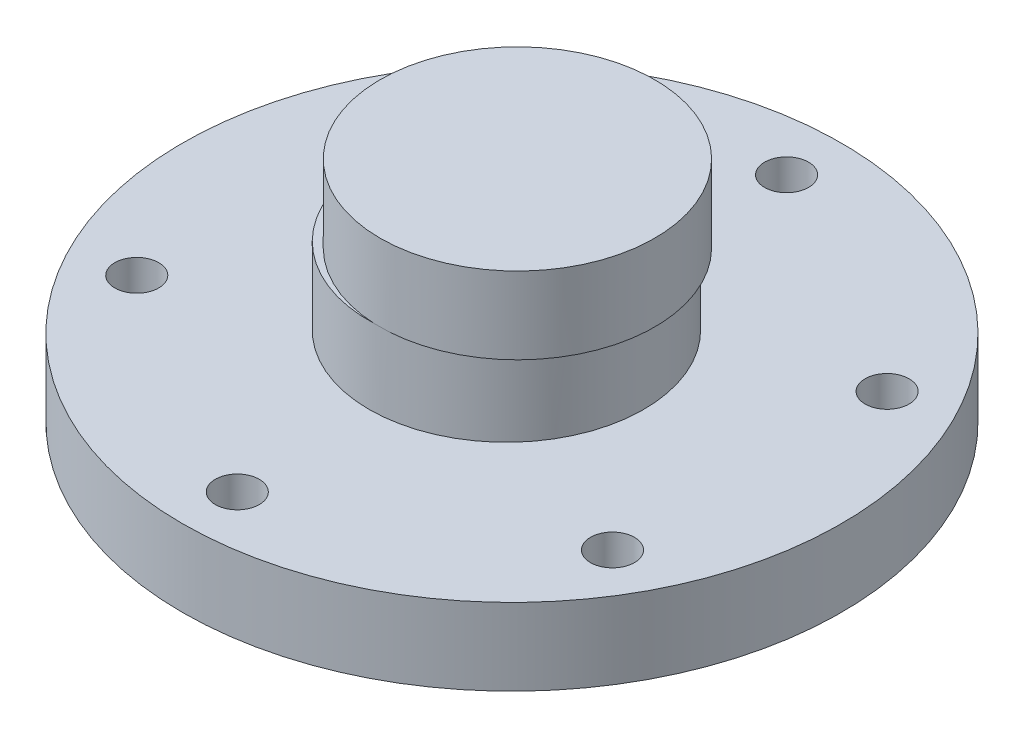
ISO-10303-21;
HEADER;
FILE_DESCRIPTION(('STEP AP214'),'2;1');
FILE_NAME('part.step','',(''),(''),'','','');
FILE_SCHEMA(('AUTOMOTIVE_DESIGN { 1 0 10303 214 1 1 1 1 }'));
ENDSEC;
DATA;
#1=APPLICATION_CONTEXT('core data for automotive mechanical design processes');
#2=APPLICATION_PROTOCOL_DEFINITION('international standard','automotive_design',2000,#1);
#3=PRODUCT_CONTEXT('',#1,'mechanical');
#4=PRODUCT('Part','Part','',(#3));
#5=PRODUCT_RELATED_PRODUCT_CATEGORY('part','',(#4));
#6=PRODUCT_DEFINITION_FORMATION('','',#4);
#7=PRODUCT_DEFINITION_CONTEXT('part definition',#1,'design');
#8=PRODUCT_DEFINITION('design','',#6,#7);
#9=PRODUCT_DEFINITION_SHAPE('','',#8);
#10=(LENGTH_UNIT() NAMED_UNIT(*) SI_UNIT(.MILLI.,.METRE.));
#11=(NAMED_UNIT(*) PLANE_ANGLE_UNIT() SI_UNIT($,.RADIAN.));
#12=(NAMED_UNIT(*) SI_UNIT($,.STERADIAN.) SOLID_ANGLE_UNIT());
#13=UNCERTAINTY_MEASURE_WITH_UNIT(LENGTH_MEASURE(1.E-05),#10,'distance_accuracy_value','');
#14=(GEOMETRIC_REPRESENTATION_CONTEXT(3) GLOBAL_UNCERTAINTY_ASSIGNED_CONTEXT((#13)) GLOBAL_UNIT_ASSIGNED_CONTEXT((#10,
#11,#12)) REPRESENTATION_CONTEXT('',''));
#15=CARTESIAN_POINT('',(0.,0.,0.));
#16=DIRECTION('',(0.,0.,1.));
#17=DIRECTION('',(1.,0.,0.));
#18=AXIS2_PLACEMENT_3D('',#15,#16,#17);
#19=CARTESIAN_POINT('',(0.,7.,0.));
#20=DIRECTION('',(0.,1.,0.));
#21=DIRECTION('',(0.,0.,1.));
#22=AXIS2_PLACEMENT_3D('',#19,#20,#21);
#23=PLANE('',#22);
#24=CARTESIAN_POINT('',(-0.5,7.,0.));
#25=DIRECTION('',(0.,1.,0.));
#26=DIRECTION('',(0.,0.,1.));
#27=AXIS2_PLACEMENT_3D('',#24,#25,#26);
#28=CIRCLE('',#27,12.5);
#29=CARTESIAN_POINT('',(-0.5,7.,12.5));
#30=VERTEX_POINT('',#29);
#31=EDGE_CURVE('E62',#30,#30,#28,.T.);
#32=ORIENTED_EDGE('',*,*,#31,.F.);
#33=EDGE_LOOP('',(#32));
#34=FACE_BOUND('',#33,.T.);
#35=CARTESIAN_POINT('',(-21.6506350946094,7.,12.5000000000009));
#36=DIRECTION('',(0.,1.,0.));
#37=DIRECTION('',(0.,0.,1.));
#38=AXIS2_PLACEMENT_3D('',#35,#36,#37);
#39=CIRCLE('',#38,2.00000000000202);
#40=CARTESIAN_POINT('',(-21.6506350946094,7.,14.5000000000029));
#41=VERTEX_POINT('',#40);
#42=EDGE_CURVE('E80',#41,#41,#39,.T.);
#43=ORIENTED_EDGE('',*,*,#42,.F.);
#44=EDGE_LOOP('',(#43));
#45=FACE_BOUND('',#44,.T.);
#46=CARTESIAN_POINT('',(21.6506350946126,7.,12.4999999999991));
#47=DIRECTION('',(0.,1.,0.));
#48=DIRECTION('',(0.,0.,1.));
#49=AXIS2_PLACEMENT_3D('',#46,#47,#48);
#50=CIRCLE('',#49,2.00000000000137);
#51=CARTESIAN_POINT('',(21.6506350946126,7.,14.5000000000004));
#52=VERTEX_POINT('',#51);
#53=EDGE_CURVE('E92',#52,#52,#50,.T.);
#54=ORIENTED_EDGE('',*,*,#53,.F.);
#55=EDGE_LOOP('',(#54));
#56=FACE_BOUND('',#55,.T.);
#57=CARTESIAN_POINT('',(0.,7.,-25.));
#58=DIRECTION('',(0.,1.,0.));
#59=DIRECTION('',(0.,0.,1.));
#60=AXIS2_PLACEMENT_3D('',#57,#58,#59);
#61=CIRCLE('',#60,2.);
#62=CARTESIAN_POINT('',(0.,7.,-23.));
#63=VERTEX_POINT('',#62);
#64=EDGE_CURVE('E104',#63,#63,#61,.T.);
#65=ORIENTED_EDGE('',*,*,#64,.F.);
#66=EDGE_LOOP('',(#65));
#67=FACE_BOUND('',#66,.T.);
#68=CARTESIAN_POINT('',(0.,7.,0.));
#69=DIRECTION('',(0.,1.,0.));
#70=DIRECTION('',(0.,0.,1.));
#71=AXIS2_PLACEMENT_3D('',#68,#69,#70);
#72=CIRCLE('',#71,30.);
#73=CARTESIAN_POINT('',(0.,7.,30.));
#74=VERTEX_POINT('',#73);
#75=EDGE_CURVE('E11',#74,#74,#72,.T.);
#76=ORIENTED_EDGE('',*,*,#75,.T.);
#77=EDGE_LOOP('',(#76));
#78=FACE_BOUND('',#77,.T.);
#79=CARTESIAN_POINT('',(21.6506350946115,7.,-12.5000000000009));
#80=DIRECTION('',(0.,1.,0.));
#81=DIRECTION('',(0.,0.,1.));
#82=AXIS2_PLACEMENT_3D('',#79,#80,#81);
#83=CIRCLE('',#82,2.0000000000003);
#84=CARTESIAN_POINT('',(21.6506350946115,7.,-10.5000000000006));
#85=VERTEX_POINT('',#84);
#86=EDGE_CURVE('E98',#85,#85,#83,.T.);
#87=ORIENTED_EDGE('',*,*,#86,.F.);
#88=EDGE_LOOP('',(#87));
#89=FACE_BOUND('',#88,.T.);
#90=CARTESIAN_POINT('',(2.1224433562867E-12,7.,25.));
#91=DIRECTION('',(0.,1.,0.));
#92=DIRECTION('',(0.,0.,1.));
#93=AXIS2_PLACEMENT_3D('',#90,#91,#92);
#94=CIRCLE('',#93,2.0000000000022);
#95=CARTESIAN_POINT('',(2.1224433562867E-12,7.,27.0000000000022));
#96=VERTEX_POINT('',#95);
#97=EDGE_CURVE('E86',#96,#96,#94,.T.);
#98=ORIENTED_EDGE('',*,*,#97,.F.);
#99=EDGE_LOOP('',(#98));
#100=FACE_BOUND('',#99,.T.);
#101=CARTESIAN_POINT('',(-21.6506350946104,7.,-12.4999999999991));
#102=DIRECTION('',(0.,1.,0.));
#103=DIRECTION('',(0.,0.,1.));
#104=AXIS2_PLACEMENT_3D('',#101,#102,#103);
#105=CIRCLE('',#104,2.00000000000107);
#106=CARTESIAN_POINT('',(-21.6506350946104,7.,-10.499999999998));
#107=VERTEX_POINT('',#106);
#108=EDGE_CURVE('E74',#107,#107,#105,.T.);
#109=ORIENTED_EDGE('',*,*,#108,.F.);
#110=EDGE_LOOP('',(#109));
#111=FACE_BOUND('',#110,.T.);
#112=ADVANCED_FACE('F33',(#34,#45,#56,#67,#78,#89,#100,#111),#23,.T.);
#113=CARTESIAN_POINT('',(0.,0.,0.));
#114=DIRECTION('',(0.,1.,0.));
#115=DIRECTION('',(0.,0.,1.));
#116=AXIS2_PLACEMENT_3D('',#113,#114,#115);
#117=PLANE('',#116);
#118=CARTESIAN_POINT('',(0.,0.,0.));
#119=DIRECTION('',(0.,1.,0.));
#120=DIRECTION('',(0.,0.,1.));
#121=AXIS2_PLACEMENT_3D('',#118,#119,#120);
#122=CIRCLE('',#121,30.);
#123=CARTESIAN_POINT('',(0.,0.,30.));
#124=VERTEX_POINT('',#123);
#125=EDGE_CURVE('E37',#124,#124,#122,.T.);
#126=ORIENTED_EDGE('',*,*,#125,.F.);
#127=EDGE_LOOP('',(#126));
#128=FACE_BOUND('',#127,.T.);
#129=CARTESIAN_POINT('',(0.,0.,-25.));
#130=DIRECTION('',(0.,1.,0.));
#131=DIRECTION('',(0.,0.,1.));
#132=AXIS2_PLACEMENT_3D('',#129,#130,#131);
#133=CIRCLE('',#132,2.);
#134=CARTESIAN_POINT('',(0.,0.,-23.));
#135=VERTEX_POINT('',#134);
#136=EDGE_CURVE('E101',#135,#135,#133,.T.);
#137=ORIENTED_EDGE('',*,*,#136,.T.);
#138=EDGE_LOOP('',(#137));
#139=FACE_BOUND('',#138,.T.);
#140=CARTESIAN_POINT('',(21.6506350946115,0.,-12.5000000000009));
#141=DIRECTION('',(0.,1.,0.));
#142=DIRECTION('',(0.,0.,1.));
#143=AXIS2_PLACEMENT_3D('',#140,#141,#142);
#144=CIRCLE('',#143,2.0000000000003);
#145=CARTESIAN_POINT('',(21.6506350946115,0.,-10.5000000000006));
#146=VERTEX_POINT('',#145);
#147=EDGE_CURVE('E95',#146,#146,#144,.T.);
#148=ORIENTED_EDGE('',*,*,#147,.T.);
#149=EDGE_LOOP('',(#148));
#150=FACE_BOUND('',#149,.T.);
#151=CARTESIAN_POINT('',(21.6506350946126,0.,12.4999999999991));
#152=DIRECTION('',(0.,1.,0.));
#153=DIRECTION('',(0.,0.,1.));
#154=AXIS2_PLACEMENT_3D('',#151,#152,#153);
#155=CIRCLE('',#154,2.00000000000137);
#156=CARTESIAN_POINT('',(21.6506350946126,0.,14.5000000000004));
#157=VERTEX_POINT('',#156);
#158=EDGE_CURVE('E89',#157,#157,#155,.T.);
#159=ORIENTED_EDGE('',*,*,#158,.T.);
#160=EDGE_LOOP('',(#159));
#161=FACE_BOUND('',#160,.T.);
#162=CARTESIAN_POINT('',(2.1224433562867E-12,0.,25.));
#163=DIRECTION('',(0.,1.,0.));
#164=DIRECTION('',(0.,0.,1.));
#165=AXIS2_PLACEMENT_3D('',#162,#163,#164);
#166=CIRCLE('',#165,2.0000000000022);
#167=CARTESIAN_POINT('',(2.1224433562867E-12,0.,27.0000000000022));
#168=VERTEX_POINT('',#167);
#169=EDGE_CURVE('E83',#168,#168,#166,.T.);
#170=ORIENTED_EDGE('',*,*,#169,.T.);
#171=EDGE_LOOP('',(#170));
#172=FACE_BOUND('',#171,.T.);
#173=CARTESIAN_POINT('',(-21.6506350946094,0.,12.5000000000009));
#174=DIRECTION('',(0.,1.,0.));
#175=DIRECTION('',(0.,0.,1.));
#176=AXIS2_PLACEMENT_3D('',#173,#174,#175);
#177=CIRCLE('',#176,2.00000000000202);
#178=CARTESIAN_POINT('',(-21.6506350946094,0.,14.5000000000029));
#179=VERTEX_POINT('',#178);
#180=EDGE_CURVE('E77',#179,#179,#177,.T.);
#181=ORIENTED_EDGE('',*,*,#180,.T.);
#182=EDGE_LOOP('',(#181));
#183=FACE_BOUND('',#182,.T.);
#184=CARTESIAN_POINT('',(-21.6506350946104,0.,-12.4999999999991));
#185=DIRECTION('',(0.,1.,0.));
#186=DIRECTION('',(0.,0.,1.));
#187=AXIS2_PLACEMENT_3D('',#184,#185,#186);
#188=CIRCLE('',#187,2.00000000000107);
#189=CARTESIAN_POINT('',(-21.6506350946104,0.,-10.499999999998));
#190=VERTEX_POINT('',#189);
#191=EDGE_CURVE('E59',#190,#190,#188,.T.);
#192=ORIENTED_EDGE('',*,*,#191,.T.);
#193=EDGE_LOOP('',(#192));
#194=FACE_BOUND('',#193,.T.);
#195=ADVANCED_FACE('F110',(#128,#139,#150,#161,#172,#183,#194),#117,.F.);
#196=CARTESIAN_POINT('',(0.,7.,0.));
#197=DIRECTION('',(0.,-1.,0.));
#198=DIRECTION('',(0.,0.,-1.));
#199=AXIS2_PLACEMENT_3D('',#196,#197,#198);
#200=CYLINDRICAL_SURFACE('',#199,30.);
#201=ORIENTED_EDGE('',*,*,#75,.F.);
#202=EDGE_LOOP('',(#201));
#203=FACE_BOUND('',#202,.T.);
#204=ORIENTED_EDGE('',*,*,#125,.T.);
#205=EDGE_LOOP('',(#204));
#206=FACE_BOUND('',#205,.T.);
#207=ADVANCED_FACE('F35',(#203,#206),#200,.T.);
#208=CARTESIAN_POINT('',(0.,7.,-25.));
#209=DIRECTION('',(0.,-1.,0.));
#210=DIRECTION('',(0.,0.,-1.));
#211=AXIS2_PLACEMENT_3D('',#208,#209,#210);
#212=CYLINDRICAL_SURFACE('',#211,2.);
#213=ORIENTED_EDGE('',*,*,#64,.T.);
#214=EDGE_LOOP('',(#213));
#215=FACE_BOUND('',#214,.T.);
#216=ORIENTED_EDGE('',*,*,#136,.F.);
#217=EDGE_LOOP('',(#216));
#218=FACE_BOUND('',#217,.T.);
#219=ADVANCED_FACE('F113',(#215,#218),#212,.F.);
#220=CARTESIAN_POINT('',(21.6506350946115,7.,-12.5000000000009));
#221=DIRECTION('',(0.,-1.,0.));
#222=DIRECTION('',(0.,0.,-1.));
#223=AXIS2_PLACEMENT_3D('',#220,#221,#222);
#224=CYLINDRICAL_SURFACE('',#223,2.0000000000003);
#225=ORIENTED_EDGE('',*,*,#86,.T.);
#226=EDGE_LOOP('',(#225));
#227=FACE_BOUND('',#226,.T.);
#228=ORIENTED_EDGE('',*,*,#147,.F.);
#229=EDGE_LOOP('',(#228));
#230=FACE_BOUND('',#229,.T.);
#231=ADVANCED_FACE('F115',(#227,#230),#224,.F.);
#232=CARTESIAN_POINT('',(21.6506350946126,7.,12.4999999999991));
#233=DIRECTION('',(0.,-1.,0.));
#234=DIRECTION('',(0.,0.,-1.));
#235=AXIS2_PLACEMENT_3D('',#232,#233,#234);
#236=CYLINDRICAL_SURFACE('',#235,2.00000000000137);
#237=ORIENTED_EDGE('',*,*,#53,.T.);
#238=EDGE_LOOP('',(#237));
#239=FACE_BOUND('',#238,.T.);
#240=ORIENTED_EDGE('',*,*,#158,.F.);
#241=EDGE_LOOP('',(#240));
#242=FACE_BOUND('',#241,.T.);
#243=ADVANCED_FACE('F122',(#239,#242),#236,.F.);
#244=CARTESIAN_POINT('',(2.1224433562867E-12,7.,25.));
#245=DIRECTION('',(0.,-1.,0.));
#246=DIRECTION('',(0.,0.,-1.));
#247=AXIS2_PLACEMENT_3D('',#244,#245,#246);
#248=CYLINDRICAL_SURFACE('',#247,2.0000000000022);
#249=ORIENTED_EDGE('',*,*,#97,.T.);
#250=EDGE_LOOP('',(#249));
#251=FACE_BOUND('',#250,.T.);
#252=ORIENTED_EDGE('',*,*,#169,.F.);
#253=EDGE_LOOP('',(#252));
#254=FACE_BOUND('',#253,.T.);
#255=ADVANCED_FACE('F161',(#251,#254),#248,.F.);
#256=CARTESIAN_POINT('',(-21.6506350946094,7.,12.5000000000009));
#257=DIRECTION('',(0.,-1.,0.));
#258=DIRECTION('',(0.,0.,-1.));
#259=AXIS2_PLACEMENT_3D('',#256,#257,#258);
#260=CYLINDRICAL_SURFACE('',#259,2.00000000000202);
#261=ORIENTED_EDGE('',*,*,#42,.T.);
#262=EDGE_LOOP('',(#261));
#263=FACE_BOUND('',#262,.T.);
#264=ORIENTED_EDGE('',*,*,#180,.F.);
#265=EDGE_LOOP('',(#264));
#266=FACE_BOUND('',#265,.T.);
#267=ADVANCED_FACE('F152',(#263,#266),#260,.F.);
#268=CARTESIAN_POINT('',(-21.6506350946104,7.,-12.4999999999991));
#269=DIRECTION('',(0.,-1.,0.));
#270=DIRECTION('',(0.,0.,-1.));
#271=AXIS2_PLACEMENT_3D('',#268,#269,#270);
#272=CYLINDRICAL_SURFACE('',#271,2.00000000000107);
#273=ORIENTED_EDGE('',*,*,#108,.T.);
#274=EDGE_LOOP('',(#273));
#275=FACE_BOUND('',#274,.T.);
#276=ORIENTED_EDGE('',*,*,#191,.F.);
#277=EDGE_LOOP('',(#276));
#278=FACE_BOUND('',#277,.T.);
#279=ADVANCED_FACE('F149',(#275,#278),#272,.F.);
#280=CARTESIAN_POINT('',(-0.5,14.,0.));
#281=DIRECTION('',(0.,-1.,0.));
#282=DIRECTION('',(0.,0.,-1.));
#283=AXIS2_PLACEMENT_3D('',#280,#281,#282);
#284=CYLINDRICAL_SURFACE('',#283,12.5);
#285=CARTESIAN_POINT('',(-0.5,14.,0.));
#286=DIRECTION('',(0.,1.,0.));
#287=DIRECTION('',(0.,0.,1.));
#288=AXIS2_PLACEMENT_3D('',#285,#286,#287);
#289=CIRCLE('',#288,12.5);
#290=CARTESIAN_POINT('',(0.,14.,12.4899959967968));
#291=VERTEX_POINT('',#290);
#292=CARTESIAN_POINT('',(0.,14.,-12.4899959967968));
#293=VERTEX_POINT('',#292);
#294=EDGE_CURVE('E52',#291,#293,#289,.T.);
#295=ORIENTED_EDGE('',*,*,#294,.F.);
#296=EDGE_CURVE('E55',#293,#291,#289,.T.);
#297=ORIENTED_EDGE('',*,*,#296,.F.);
#298=EDGE_LOOP('',(#295,#297));
#299=FACE_BOUND('',#298,.T.);
#300=ORIENTED_EDGE('',*,*,#31,.T.);
#301=EDGE_LOOP('',(#300));
#302=FACE_BOUND('',#301,.T.);
#303=ADVANCED_FACE('F53',(#299,#302),#284,.T.);
#304=CARTESIAN_POINT('',(-0.5,14.,0.));
#305=DIRECTION('',(0.,1.,0.));
#306=DIRECTION('',(0.,0.,1.));
#307=AXIS2_PLACEMENT_3D('',#304,#305,#306);
#308=PLANE('',#307);
#309=CARTESIAN_POINT('',(0.5,14.,0.));
#310=DIRECTION('',(0.,1.,0.));
#311=DIRECTION('',(0.,0.,1.));
#312=AXIS2_PLACEMENT_3D('',#309,#310,#311);
#313=CIRCLE('',#312,12.5);
#314=EDGE_CURVE('E47',#293,#291,#313,.T.);
#315=ORIENTED_EDGE('',*,*,#314,.F.);
#316=ORIENTED_EDGE('',*,*,#296,.T.);
#317=EDGE_LOOP('',(#315,#316));
#318=FACE_BOUND('',#317,.T.);
#319=ADVANCED_FACE('F61',(#318),#308,.T.);
#320=CARTESIAN_POINT('',(0.5,14.,0.));
#321=DIRECTION('',(0.,1.,0.));
#322=DIRECTION('',(0.,0.,1.));
#323=AXIS2_PLACEMENT_3D('',#320,#321,#322);
#324=PLANE('',#323);
#325=EDGE_CURVE('E63',#291,#293,#313,.T.);
#326=ORIENTED_EDGE('',*,*,#325,.F.);
#327=ORIENTED_EDGE('',*,*,#294,.T.);
#328=EDGE_LOOP('',(#326,#327));
#329=FACE_BOUND('',#328,.T.);
#330=ADVANCED_FACE('F64',(#329),#324,.F.);
#331=CARTESIAN_POINT('',(0.5,21.,0.));
#332=DIRECTION('',(0.,-1.,0.));
#333=DIRECTION('',(0.,0.,-1.));
#334=AXIS2_PLACEMENT_3D('',#331,#332,#333);
#335=CYLINDRICAL_SURFACE('',#334,12.5);
#336=CARTESIAN_POINT('',(0.5,21.,0.));
#337=DIRECTION('',(0.,1.,0.));
#338=DIRECTION('',(0.,0.,1.));
#339=AXIS2_PLACEMENT_3D('',#336,#337,#338);
#340=CIRCLE('',#339,12.5);
#341=CARTESIAN_POINT('',(0.5,21.,12.5));
#342=VERTEX_POINT('',#341);
#343=EDGE_CURVE('E68',#342,#342,#340,.T.);
#344=ORIENTED_EDGE('',*,*,#343,.F.);
#345=EDGE_LOOP('',(#344));
#346=FACE_BOUND('',#345,.T.);
#347=ORIENTED_EDGE('',*,*,#314,.T.);
#348=ORIENTED_EDGE('',*,*,#325,.T.);
#349=EDGE_LOOP('',(#347,#348));
#350=FACE_BOUND('',#349,.T.);
#351=ADVANCED_FACE('F67',(#346,#350),#335,.T.);
#352=CARTESIAN_POINT('',(0.5,21.,0.));
#353=DIRECTION('',(0.,1.,0.));
#354=DIRECTION('',(0.,0.,1.));
#355=AXIS2_PLACEMENT_3D('',#352,#353,#354);
#356=PLANE('',#355);
#357=ORIENTED_EDGE('',*,*,#343,.T.);
#358=EDGE_LOOP('',(#357));
#359=FACE_BOUND('',#358,.T.);
#360=ADVANCED_FACE('F231',(#359),#356,.T.);
#361=CLOSED_SHELL('',(#112,#195,#207,#219,#231,#243,#255,#267,#279,#303,#319,#330,#351,#360));
#362=MANIFOLD_SOLID_BREP('B2',#361);
#363=ADVANCED_BREP_SHAPE_REPRESENTATION('',(#18,#362),#14);
#364=SHAPE_DEFINITION_REPRESENTATION(#9,#363);
ENDSEC;
END-ISO-10303-21;
